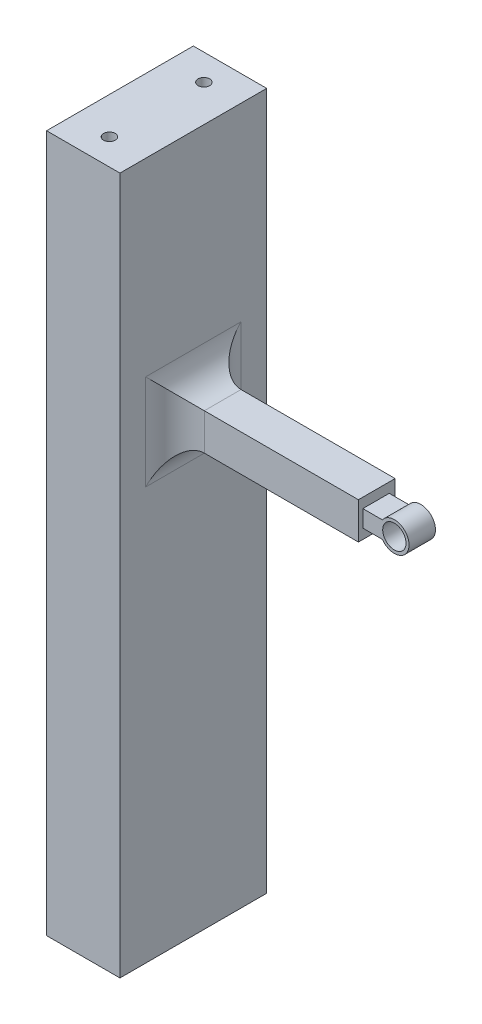
ISO-10303-21;
HEADER;
FILE_DESCRIPTION(('STEP AP214'),'2;1');
FILE_NAME('part.step','',(''),(''),'','','');
FILE_SCHEMA(('AUTOMOTIVE_DESIGN { 1 0 10303 214 1 1 1 1 }'));
ENDSEC;
DATA;
#1=APPLICATION_CONTEXT('core data for automotive mechanical design processes');
#2=APPLICATION_PROTOCOL_DEFINITION('international standard','automotive_design',2000,#1);
#3=PRODUCT_CONTEXT('',#1,'mechanical');
#4=PRODUCT('Part','Part','',(#3));
#5=PRODUCT_RELATED_PRODUCT_CATEGORY('part','',(#4));
#6=PRODUCT_DEFINITION_FORMATION('','',#4);
#7=PRODUCT_DEFINITION_CONTEXT('part definition',#1,'design');
#8=PRODUCT_DEFINITION('design','',#6,#7);
#9=PRODUCT_DEFINITION_SHAPE('','',#8);
#10=(LENGTH_UNIT() NAMED_UNIT(*) SI_UNIT(.MILLI.,.METRE.));
#11=(NAMED_UNIT(*) PLANE_ANGLE_UNIT() SI_UNIT($,.RADIAN.));
#12=(NAMED_UNIT(*) SI_UNIT($,.STERADIAN.) SOLID_ANGLE_UNIT());
#13=UNCERTAINTY_MEASURE_WITH_UNIT(LENGTH_MEASURE(1.E-05),#10,'distance_accuracy_value','');
#14=(GEOMETRIC_REPRESENTATION_CONTEXT(3) GLOBAL_UNCERTAINTY_ASSIGNED_CONTEXT((#13)) GLOBAL_UNIT_ASSIGNED_CONTEXT((#10,
#11,#12)) REPRESENTATION_CONTEXT('',''));
#15=CARTESIAN_POINT('',(0.,0.,0.));
#16=DIRECTION('',(0.,0.,1.));
#17=DIRECTION('',(1.,0.,0.));
#18=AXIS2_PLACEMENT_3D('',#15,#16,#17);
#19=CARTESIAN_POINT('',(137.135295270355,0.,0.));
#20=DIRECTION('',(1.,0.,0.));
#21=DIRECTION('',(0.,1.,0.));
#22=AXIS2_PLACEMENT_3D('',#19,#20,#21);
#23=PLANE('',#22);
#24=DIRECTION('',(0.,1.,0.));
#25=VECTOR('',#24,1.);
#26=CARTESIAN_POINT('',(137.135295270355,735.969884115391,75.));
#27=LINE('',#26,#25);
#28=CARTESIAN_POINT('',(137.135295270355,685.969884115391,75.));
#29=VERTEX_POINT('',#28);
#30=CARTESIAN_POINT('',(137.135295270355,735.969884115391,75.));
#31=VERTEX_POINT('',#30);
#32=EDGE_CURVE('E200',#29,#31,#27,.T.);
#33=ORIENTED_EDGE('',*,*,#32,.T.);
#34=DIRECTION('',(0.,0.,1.));
#35=VECTOR('',#34,1.);
#36=CARTESIAN_POINT('',(137.135295270355,735.969884115391,125.));
#37=LINE('',#36,#35);
#38=CARTESIAN_POINT('',(137.135295270355,735.969884115391,125.));
#39=VERTEX_POINT('',#38);
#40=EDGE_CURVE('E206',#31,#39,#37,.T.);
#41=ORIENTED_EDGE('',*,*,#40,.T.);
#42=DIRECTION('',(0.,-1.,0.));
#43=VECTOR('',#42,1.);
#44=CARTESIAN_POINT('',(137.135295270355,735.969884115391,125.));
#45=LINE('',#44,#43);
#46=CARTESIAN_POINT('',(137.135295270355,685.969884115391,125.));
#47=VERTEX_POINT('',#46);
#48=EDGE_CURVE('E211',#39,#47,#45,.T.);
#49=ORIENTED_EDGE('',*,*,#48,.T.);
#50=DIRECTION('',(0.,0.,-1.));
#51=VECTOR('',#50,1.);
#52=CARTESIAN_POINT('',(137.135295270355,685.969884115391,125.));
#53=LINE('',#52,#51);
#54=EDGE_CURVE('E218',#47,#29,#53,.T.);
#55=ORIENTED_EDGE('',*,*,#54,.T.);
#56=EDGE_LOOP('',(#33,#41,#49,#55));
#57=FACE_BOUND('',#56,.T.);
#58=DIRECTION('',(0.,0.,1.));
#59=VECTOR('',#58,1.);
#60=CARTESIAN_POINT('',(137.135295270355,699.447016823861,83.));
#61=LINE('',#60,#59);
#62=CARTESIAN_POINT('',(137.135295270355,699.447016823861,83.));
#63=VERTEX_POINT('',#62);
#64=CARTESIAN_POINT('',(137.135295270355,699.447016823861,119.));
#65=VERTEX_POINT('',#64);
#66=EDGE_CURVE('E192',#63,#65,#61,.T.);
#67=ORIENTED_EDGE('',*,*,#66,.T.);
#68=DIRECTION('',(0.,1.,0.));
#69=VECTOR('',#68,1.);
#70=CARTESIAN_POINT('',(137.135295270353,-3.30323083755885E-13,119.));
#71=LINE('',#70,#69);
#72=CARTESIAN_POINT('',(137.135295270355,722.49275140692,119.));
#73=VERTEX_POINT('',#72);
#74=EDGE_CURVE('E263',#65,#73,#71,.T.);
#75=ORIENTED_EDGE('',*,*,#74,.T.);
#76=DIRECTION('',(0.,0.,1.));
#77=VECTOR('',#76,1.);
#78=CARTESIAN_POINT('',(137.135295270355,722.49275140692,83.));
#79=LINE('',#78,#77);
#80=CARTESIAN_POINT('',(137.135295270355,722.49275140692,83.));
#81=VERTEX_POINT('',#80);
#82=EDGE_CURVE('E270',#81,#73,#79,.T.);
#83=ORIENTED_EDGE('',*,*,#82,.F.);
#84=DIRECTION('',(0.,1.,0.));
#85=VECTOR('',#84,1.);
#86=CARTESIAN_POINT('',(137.135295270353,-3.30323083755885E-13,83.));
#87=LINE('',#86,#85);
#88=EDGE_CURVE('E253',#63,#81,#87,.T.);
#89=ORIENTED_EDGE('',*,*,#88,.F.);
#90=EDGE_LOOP('',(#67,#75,#83,#89));
#91=FACE_BOUND('',#90,.T.);
#92=ADVANCED_FACE('F39',(#57,#91),#23,.T.);
#93=CARTESIAN_POINT('',(-112.864704729645,1033.96988411539,200.));
#94=DIRECTION('',(-1.,0.,0.));
#95=DIRECTION('',(0.,-1.,0.));
#96=AXIS2_PLACEMENT_3D('',#93,#94,#95);
#97=PLANE('',#96);
#98=DIRECTION('',(0.,0.,1.));
#99=VECTOR('',#98,1.);
#100=CARTESIAN_POINT('',(-112.864704729645,775.969884115391,75.));
#101=LINE('',#100,#99);
#102=CARTESIAN_POINT('',(-112.864704729645,775.969884115391,165.));
#103=VERTEX_POINT('',#102);
#104=CARTESIAN_POINT('',(-112.864704729645,775.969884115391,35.));
#105=VERTEX_POINT('',#104);
#106=EDGE_CURVE('E181',#103,#105,#101,.F.);
#107=ORIENTED_EDGE('',*,*,#106,.T.);
#108=DIRECTION('',(0.,1.,0.));
#109=VECTOR('',#108,1.);
#110=CARTESIAN_POINT('',(-112.864704729645,685.969884115391,35.));
#111=LINE('',#110,#109);
#112=CARTESIAN_POINT('',(-112.864704729645,645.969884115391,35.));
#113=VERTEX_POINT('',#112);
#114=EDGE_CURVE('E184',#105,#113,#111,.F.);
#115=ORIENTED_EDGE('',*,*,#114,.T.);
#116=DIRECTION('',(0.,0.,-1.));
#117=VECTOR('',#116,1.);
#118=CARTESIAN_POINT('',(-112.864704729645,645.969884115391,125.));
#119=LINE('',#118,#117);
#120=CARTESIAN_POINT('',(-112.864704729645,645.969884115391,165.));
#121=VERTEX_POINT('',#120);
#122=EDGE_CURVE('E179',#113,#121,#119,.F.);
#123=ORIENTED_EDGE('',*,*,#122,.T.);
#124=DIRECTION('',(0.,-1.,0.));
#125=VECTOR('',#124,1.);
#126=CARTESIAN_POINT('',(-112.864704729645,735.969884115391,165.));
#127=LINE('',#126,#125);
#128=EDGE_CURVE('E177',#121,#103,#127,.F.);
#129=ORIENTED_EDGE('',*,*,#128,.T.);
#130=EDGE_LOOP('',(#107,#115,#123,#129));
#131=FACE_BOUND('',#130,.T.);
#132=DIRECTION('',(0.,1.,0.));
#133=VECTOR('',#132,1.);
#134=CARTESIAN_POINT('',(-112.864704729645,1033.96988411539,200.));
#135=LINE('',#134,#133);
#136=CARTESIAN_POINT('',(-112.864704729645,83.9698841153906,200.));
#137=VERTEX_POINT('',#136);
#138=CARTESIAN_POINT('',(-112.864704729645,1033.96988411539,200.));
#139=VERTEX_POINT('',#138);
#140=EDGE_CURVE('E153',#137,#139,#135,.T.);
#141=ORIENTED_EDGE('',*,*,#140,.F.);
#142=DIRECTION('',(0.,0.,1.));
#143=VECTOR('',#142,1.);
#144=CARTESIAN_POINT('',(-112.864704729645,83.9698841153906,200.));
#145=LINE('',#144,#143);
#146=CARTESIAN_POINT('',(-112.864704729645,83.9698841153906,0.));
#147=VERTEX_POINT('',#146);
#148=EDGE_CURVE('E141',#147,#137,#145,.T.);
#149=ORIENTED_EDGE('',*,*,#148,.F.);
#150=DIRECTION('',(0.,1.,0.));
#151=VECTOR('',#150,1.);
#152=CARTESIAN_POINT('',(-112.864704729645,1033.96988411539,0.));
#153=LINE('',#152,#151);
#154=CARTESIAN_POINT('',(-112.864704729645,1033.96988411539,0.));
#155=VERTEX_POINT('',#154);
#156=EDGE_CURVE('E151',#147,#155,#153,.T.);
#157=ORIENTED_EDGE('',*,*,#156,.T.);
#158=DIRECTION('',(0.,0.,-1.));
#159=VECTOR('',#158,1.);
#160=CARTESIAN_POINT('',(-112.864704729645,1033.96988411539,200.));
#161=LINE('',#160,#159);
#162=EDGE_CURVE('E169',#139,#155,#161,.T.);
#163=ORIENTED_EDGE('',*,*,#162,.F.);
#164=EDGE_LOOP('',(#141,#149,#157,#163));
#165=FACE_BOUND('',#164,.T.);
#166=ADVANCED_FACE('F149',(#131,#165),#97,.F.);
#167=CARTESIAN_POINT('',(-112.864704729645,1033.96988411539,200.));
#168=DIRECTION('',(0.,-1.,0.));
#169=DIRECTION('',(0.,0.,-1.));
#170=AXIS2_PLACEMENT_3D('',#167,#168,#169);
#171=PLANE('',#170);
#172=CARTESIAN_POINT('',(-162.864704729645,1033.96988411539,35.6235));
#173=DIRECTION('',(0.,1.,0.));
#174=DIRECTION('',(0.,0.,1.));
#175=AXIS2_PLACEMENT_3D('',#172,#173,#174);
#176=CIRCLE('',#175,8.00000000000001);
#177=CARTESIAN_POINT('',(-162.864704729645,1033.96988411539,43.6235));
#178=VERTEX_POINT('',#177);
#179=EDGE_CURVE('E517',#178,#178,#176,.T.);
#180=ORIENTED_EDGE('',*,*,#179,.F.);
#181=EDGE_LOOP('',(#180));
#182=FACE_BOUND('',#181,.T.);
#183=CARTESIAN_POINT('',(-162.864704729645,1033.96988411539,164.3765));
#184=DIRECTION('',(0.,1.,0.));
#185=DIRECTION('',(0.,0.,1.));
#186=AXIS2_PLACEMENT_3D('',#183,#184,#185);
#187=CIRCLE('',#186,8.00000000000001);
#188=CARTESIAN_POINT('',(-162.864704729645,1033.96988411539,172.3765));
#189=VERTEX_POINT('',#188);
#190=EDGE_CURVE('E516',#189,#189,#187,.T.);
#191=ORIENTED_EDGE('',*,*,#190,.F.);
#192=EDGE_LOOP('',(#191));
#193=FACE_BOUND('',#192,.T.);
#194=DIRECTION('',(-1.,0.,0.));
#195=VECTOR('',#194,1.);
#196=CARTESIAN_POINT('',(-112.864704729645,1033.96988411539,0.));
#197=LINE('',#196,#195);
#198=CARTESIAN_POINT('',(-212.864704729645,1033.96988411539,0.));
#199=VERTEX_POINT('',#198);
#200=EDGE_CURVE('E159',#155,#199,#197,.T.);
#201=ORIENTED_EDGE('',*,*,#200,.T.);
#202=DIRECTION('',(0.,0.,-1.));
#203=VECTOR('',#202,1.);
#204=CARTESIAN_POINT('',(-212.864704729645,1033.96988411539,200.));
#205=LINE('',#204,#203);
#206=CARTESIAN_POINT('',(-212.864704729645,1033.96988411539,200.));
#207=VERTEX_POINT('',#206);
#208=EDGE_CURVE('E171',#207,#199,#205,.T.);
#209=ORIENTED_EDGE('',*,*,#208,.F.);
#210=DIRECTION('',(-1.,0.,0.));
#211=VECTOR('',#210,1.);
#212=CARTESIAN_POINT('',(-112.864704729645,1033.96988411539,200.));
#213=LINE('',#212,#211);
#214=EDGE_CURVE('E160',#139,#207,#213,.T.);
#215=ORIENTED_EDGE('',*,*,#214,.F.);
#216=ORIENTED_EDGE('',*,*,#162,.T.);
#217=EDGE_LOOP('',(#201,#209,#215,#216));
#218=FACE_BOUND('',#217,.T.);
#219=ADVANCED_FACE('F236',(#182,#193,#218),#171,.F.);
#220=CARTESIAN_POINT('',(-212.864704729645,1033.96988411539,200.));
#221=DIRECTION('',(1.,0.,0.));
#222=DIRECTION('',(0.,0.,-1.));
#223=AXIS2_PLACEMENT_3D('',#220,#221,#222);
#224=PLANE('',#223);
#225=DIRECTION('',(0.,-1.,0.));
#226=VECTOR('',#225,1.);
#227=CARTESIAN_POINT('',(-212.864704729645,1033.96988411539,0.));
#228=LINE('',#227,#226);
#229=CARTESIAN_POINT('',(-212.864704729645,83.9698841153906,0.));
#230=VERTEX_POINT('',#229);
#231=EDGE_CURVE('E161',#199,#230,#228,.T.);
#232=ORIENTED_EDGE('',*,*,#231,.T.);
#233=DIRECTION('',(0.,0.,-1.));
#234=VECTOR('',#233,1.);
#235=CARTESIAN_POINT('',(-212.864704729645,83.9698841153906,0.));
#236=LINE('',#235,#234);
#237=CARTESIAN_POINT('',(-212.864704729645,83.9698841153906,200.));
#238=VERTEX_POINT('',#237);
#239=EDGE_CURVE('E56',#238,#230,#236,.T.);
#240=ORIENTED_EDGE('',*,*,#239,.F.);
#241=DIRECTION('',(0.,-1.,0.));
#242=VECTOR('',#241,1.);
#243=CARTESIAN_POINT('',(-212.864704729645,1033.96988411539,200.));
#244=LINE('',#243,#242);
#245=EDGE_CURVE('E164',#207,#238,#244,.T.);
#246=ORIENTED_EDGE('',*,*,#245,.F.);
#247=ORIENTED_EDGE('',*,*,#208,.T.);
#248=EDGE_LOOP('',(#232,#240,#246,#247));
#249=FACE_BOUND('',#248,.T.);
#250=ADVANCED_FACE('F329',(#249),#224,.F.);
#251=CARTESIAN_POINT('',(0.,0.,200.));
#252=DIRECTION('',(0.,0.,1.));
#253=DIRECTION('',(1.,0.,0.));
#254=AXIS2_PLACEMENT_3D('',#251,#252,#253);
#255=PLANE('',#254);
#256=DIRECTION('',(-1.,0.,0.));
#257=VECTOR('',#256,1.);
#258=CARTESIAN_POINT('',(-212.864704729645,83.9698841153906,200.));
#259=LINE('',#258,#257);
#260=EDGE_CURVE('E154',#137,#238,#259,.T.);
#261=ORIENTED_EDGE('',*,*,#260,.F.);
#262=ORIENTED_EDGE('',*,*,#140,.T.);
#263=ORIENTED_EDGE('',*,*,#214,.T.);
#264=ORIENTED_EDGE('',*,*,#245,.T.);
#265=EDGE_LOOP('',(#261,#262,#263,#264));
#266=FACE_BOUND('',#265,.T.);
#267=ADVANCED_FACE('F239',(#266),#255,.T.);
#268=CARTESIAN_POINT('',(0.,0.,0.));
#269=DIRECTION('',(0.,0.,1.));
#270=DIRECTION('',(1.,0.,0.));
#271=AXIS2_PLACEMENT_3D('',#268,#269,#270);
#272=PLANE('',#271);
#273=ORIENTED_EDGE('',*,*,#156,.F.);
#274=DIRECTION('',(1.,0.,0.));
#275=VECTOR('',#274,1.);
#276=CARTESIAN_POINT('',(-112.864704729645,83.9698841153906,0.));
#277=LINE('',#276,#275);
#278=EDGE_CURVE('E138',#230,#147,#277,.T.);
#279=ORIENTED_EDGE('',*,*,#278,.F.);
#280=ORIENTED_EDGE('',*,*,#231,.F.);
#281=ORIENTED_EDGE('',*,*,#200,.F.);
#282=EDGE_LOOP('',(#273,#279,#280,#281));
#283=FACE_BOUND('',#282,.T.);
#284=ADVANCED_FACE('F157',(#283),#272,.F.);
#285=CARTESIAN_POINT('',(137.135295270355,735.969884115391,75.));
#286=DIRECTION('',(0.,0.,1.));
#287=DIRECTION('',(1.,0.,0.));
#288=AXIS2_PLACEMENT_3D('',#285,#286,#287);
#289=PLANE('',#288);
#290=DIRECTION('',(-1.,0.,0.));
#291=VECTOR('',#290,1.);
#292=CARTESIAN_POINT('',(137.135295270355,685.969884115391,75.));
#293=LINE('',#292,#291);
#294=CARTESIAN_POINT('',(-72.8647047296451,685.969884115391,75.));
#295=VERTEX_POINT('',#294);
#296=EDGE_CURVE('E220',#29,#295,#293,.T.);
#297=ORIENTED_EDGE('',*,*,#296,.T.);
#298=DIRECTION('',(0.,1.,0.));
#299=VECTOR('',#298,1.);
#300=CARTESIAN_POINT('',(-72.8647047296451,735.969884115391,75.));
#301=LINE('',#300,#299);
#302=CARTESIAN_POINT('',(-72.8647047296451,735.969884115391,75.));
#303=VERTEX_POINT('',#302);
#304=EDGE_CURVE('E48',#295,#303,#301,.T.);
#305=ORIENTED_EDGE('',*,*,#304,.T.);
#306=DIRECTION('',(-1.,0.,0.));
#307=VECTOR('',#306,1.);
#308=CARTESIAN_POINT('',(137.135295270355,735.969884115391,75.));
#309=LINE('',#308,#307);
#310=EDGE_CURVE('E229',#31,#303,#309,.T.);
#311=ORIENTED_EDGE('',*,*,#310,.F.);
#312=ORIENTED_EDGE('',*,*,#32,.F.);
#313=EDGE_LOOP('',(#297,#305,#311,#312));
#314=FACE_BOUND('',#313,.T.);
#315=ADVANCED_FACE('F322',(#314),#289,.F.);
#316=CARTESIAN_POINT('',(137.135295270355,735.969884115391,125.));
#317=DIRECTION('',(0.,-1.,0.));
#318=DIRECTION('',(1.,0.,0.));
#319=AXIS2_PLACEMENT_3D('',#316,#317,#318);
#320=PLANE('',#319);
#321=ORIENTED_EDGE('',*,*,#310,.T.);
#322=DIRECTION('',(0.,0.,1.));
#323=VECTOR('',#322,1.);
#324=CARTESIAN_POINT('',(-72.8647047296451,735.969884115391,125.));
#325=LINE('',#324,#323);
#326=CARTESIAN_POINT('',(-72.8647047296451,735.969884115391,125.));
#327=VERTEX_POINT('',#326);
#328=EDGE_CURVE('E174',#303,#327,#325,.T.);
#329=ORIENTED_EDGE('',*,*,#328,.T.);
#330=DIRECTION('',(-1.,0.,0.));
#331=VECTOR('',#330,1.);
#332=CARTESIAN_POINT('',(137.135295270355,735.969884115391,125.));
#333=LINE('',#332,#331);
#334=EDGE_CURVE('E226',#39,#327,#333,.T.);
#335=ORIENTED_EDGE('',*,*,#334,.F.);
#336=ORIENTED_EDGE('',*,*,#40,.F.);
#337=EDGE_LOOP('',(#321,#329,#335,#336));
#338=FACE_BOUND('',#337,.T.);
#339=ADVANCED_FACE('F318',(#338),#320,.F.);
#340=CARTESIAN_POINT('',(137.135295270355,735.969884115391,125.));
#341=DIRECTION('',(0.,0.,-1.));
#342=DIRECTION('',(-1.,0.,0.));
#343=AXIS2_PLACEMENT_3D('',#340,#341,#342);
#344=PLANE('',#343);
#345=ORIENTED_EDGE('',*,*,#334,.T.);
#346=DIRECTION('',(0.,-1.,0.));
#347=VECTOR('',#346,1.);
#348=CARTESIAN_POINT('',(-72.8647047296451,685.969884115391,125.));
#349=LINE('',#348,#347);
#350=CARTESIAN_POINT('',(-72.8647047296451,685.969884115391,125.));
#351=VERTEX_POINT('',#350);
#352=EDGE_CURVE('E11',#327,#351,#349,.T.);
#353=ORIENTED_EDGE('',*,*,#352,.T.);
#354=DIRECTION('',(-1.,0.,0.));
#355=VECTOR('',#354,1.);
#356=CARTESIAN_POINT('',(137.135295270355,685.969884115391,125.));
#357=LINE('',#356,#355);
#358=EDGE_CURVE('E223',#47,#351,#357,.T.);
#359=ORIENTED_EDGE('',*,*,#358,.F.);
#360=ORIENTED_EDGE('',*,*,#48,.F.);
#361=EDGE_LOOP('',(#345,#353,#359,#360));
#362=FACE_BOUND('',#361,.T.);
#363=ADVANCED_FACE('F314',(#362),#344,.F.);
#364=CARTESIAN_POINT('',(137.135295270355,685.969884115391,125.));
#365=DIRECTION('',(0.,1.,0.));
#366=DIRECTION('',(-1.,0.,0.));
#367=AXIS2_PLACEMENT_3D('',#364,#365,#366);
#368=PLANE('',#367);
#369=ORIENTED_EDGE('',*,*,#358,.T.);
#370=DIRECTION('',(0.,0.,-1.));
#371=VECTOR('',#370,1.);
#372=CARTESIAN_POINT('',(-72.8647047296451,685.969884115391,75.));
#373=LINE('',#372,#371);
#374=EDGE_CURVE('E186',#351,#295,#373,.T.);
#375=ORIENTED_EDGE('',*,*,#374,.T.);
#376=ORIENTED_EDGE('',*,*,#296,.F.);
#377=ORIENTED_EDGE('',*,*,#54,.F.);
#378=EDGE_LOOP('',(#369,#375,#376,#377));
#379=FACE_BOUND('',#378,.T.);
#380=ADVANCED_FACE('F311',(#379),#368,.F.);
#381=CARTESIAN_POINT('',(-72.8647047296451,645.969884115391,125.));
#382=DIRECTION('',(0.,0.,1.));
#383=DIRECTION('',(1.,0.,0.));
#384=AXIS2_PLACEMENT_3D('',#381,#382,#383);
#385=CYLINDRICAL_SURFACE('',#384,40.);
#386=CARTESIAN_POINT('',(-72.8647047296451,645.969884115391,165.));
#387=DIRECTION('',(0.,0.707106781186547,0.707106781186547));
#388=DIRECTION('',(0.,0.707106781186547,-0.707106781186547));
#389=AXIS2_PLACEMENT_3D('',#386,#387,#388);
#390=ELLIPSE('',#389,56.5685424949238,40.);
#391=EDGE_CURVE('E193',#121,#351,#390,.F.);
#392=ORIENTED_EDGE('',*,*,#391,.F.);
#393=ORIENTED_EDGE('',*,*,#122,.F.);
#394=CARTESIAN_POINT('',(-72.8647047296451,645.969884115391,35.));
#395=DIRECTION('',(0.,-0.707106781186547,0.707106781186547));
#396=DIRECTION('',(0.,-0.707106781186547,-0.707106781186547));
#397=AXIS2_PLACEMENT_3D('',#394,#395,#396);
#398=ELLIPSE('',#397,56.5685424949238,40.);
#399=EDGE_CURVE('E43',#295,#113,#398,.T.);
#400=ORIENTED_EDGE('',*,*,#399,.F.);
#401=ORIENTED_EDGE('',*,*,#374,.F.);
#402=EDGE_LOOP('',(#392,#393,#400,#401));
#403=FACE_BOUND('',#402,.T.);
#404=ADVANCED_FACE('F41',(#403),#385,.F.);
#405=CARTESIAN_POINT('',(-72.8647047296451,735.969884115391,35.));
#406=DIRECTION('',(0.,-1.,0.));
#407=DIRECTION('',(1.,0.,0.));
#408=AXIS2_PLACEMENT_3D('',#405,#406,#407);
#409=CYLINDRICAL_SURFACE('',#408,40.);
#410=ORIENTED_EDGE('',*,*,#399,.T.);
#411=ORIENTED_EDGE('',*,*,#114,.F.);
#412=CARTESIAN_POINT('',(-72.8647047296451,775.969884115391,35.));
#413=DIRECTION('',(0.,-0.707106781186547,-0.707106781186547));
#414=DIRECTION('',(0.,-0.707106781186547,0.707106781186547));
#415=AXIS2_PLACEMENT_3D('',#412,#413,#414);
#416=ELLIPSE('',#415,56.5685424949238,40.);
#417=EDGE_CURVE('E191',#303,#105,#416,.T.);
#418=ORIENTED_EDGE('',*,*,#417,.F.);
#419=ORIENTED_EDGE('',*,*,#304,.F.);
#420=EDGE_LOOP('',(#410,#411,#418,#419));
#421=FACE_BOUND('',#420,.T.);
#422=ADVANCED_FACE('F343',(#421),#409,.F.);
#423=CARTESIAN_POINT('',(-72.8647047296451,735.969884115391,165.));
#424=DIRECTION('',(0.,1.,0.));
#425=DIRECTION('',(-1.,0.,0.));
#426=AXIS2_PLACEMENT_3D('',#423,#424,#425);
#427=CYLINDRICAL_SURFACE('',#426,40.);
#428=ORIENTED_EDGE('',*,*,#391,.T.);
#429=ORIENTED_EDGE('',*,*,#352,.F.);
#430=CARTESIAN_POINT('',(-72.8647047296451,775.969884115391,165.));
#431=DIRECTION('',(0.,0.707106781186547,-0.707106781186547));
#432=DIRECTION('',(0.,0.707106781186547,0.707106781186547));
#433=AXIS2_PLACEMENT_3D('',#430,#431,#432);
#434=ELLIPSE('',#433,56.5685424949238,40.);
#435=EDGE_CURVE('E189',#103,#327,#434,.F.);
#436=ORIENTED_EDGE('',*,*,#435,.F.);
#437=ORIENTED_EDGE('',*,*,#128,.F.);
#438=EDGE_LOOP('',(#428,#429,#436,#437));
#439=FACE_BOUND('',#438,.T.);
#440=ADVANCED_FACE('F340',(#439),#427,.F.);
#441=CARTESIAN_POINT('',(-72.8647047296451,775.969884115391,125.));
#442=DIRECTION('',(0.,0.,-1.));
#443=DIRECTION('',(-1.,0.,0.));
#444=AXIS2_PLACEMENT_3D('',#441,#442,#443);
#445=CYLINDRICAL_SURFACE('',#444,40.);
#446=ORIENTED_EDGE('',*,*,#417,.T.);
#447=ORIENTED_EDGE('',*,*,#106,.F.);
#448=ORIENTED_EDGE('',*,*,#435,.T.);
#449=ORIENTED_EDGE('',*,*,#328,.F.);
#450=EDGE_LOOP('',(#446,#447,#448,#449));
#451=FACE_BOUND('',#450,.T.);
#452=ADVANCED_FACE('F300',(#451),#445,.F.);
#453=CARTESIAN_POINT('',(0.,699.447016823861,83.));
#454=DIRECTION('',(0.,-1.,0.));
#455=DIRECTION('',(0.,0.,-1.));
#456=AXIS2_PLACEMENT_3D('',#453,#454,#455);
#457=PLANE('',#456);
#458=DIRECTION('',(1.,0.,0.));
#459=VECTOR('',#458,1.);
#460=CARTESIAN_POINT('',(0.,699.447016823861,119.));
#461=LINE('',#460,#459);
#462=CARTESIAN_POINT('',(163.788322174953,699.447016823861,119.));
#463=VERTEX_POINT('',#462);
#464=EDGE_CURVE('E64',#65,#463,#461,.T.);
#465=ORIENTED_EDGE('',*,*,#464,.F.);
#466=ORIENTED_EDGE('',*,*,#66,.F.);
#467=DIRECTION('',(1.,0.,0.));
#468=VECTOR('',#467,1.);
#469=CARTESIAN_POINT('',(0.,699.447016823861,83.));
#470=LINE('',#469,#468);
#471=CARTESIAN_POINT('',(163.788322174953,699.447016823861,83.));
#472=VERTEX_POINT('',#471);
#473=EDGE_CURVE('E244',#63,#472,#470,.T.);
#474=ORIENTED_EDGE('',*,*,#473,.T.);
#475=DIRECTION('',(0.,0.,1.));
#476=VECTOR('',#475,1.);
#477=CARTESIAN_POINT('',(163.788322174953,699.447016823861,83.));
#478=LINE('',#477,#476);
#479=EDGE_CURVE('E214',#472,#463,#478,.T.);
#480=ORIENTED_EDGE('',*,*,#479,.T.);
#481=EDGE_LOOP('',(#465,#466,#474,#480));
#482=FACE_BOUND('',#481,.T.);
#483=ADVANCED_FACE('F275',(#482),#457,.T.);
#484=CARTESIAN_POINT('',(0.,722.49275140692,83.));
#485=DIRECTION('',(0.,-1.,0.));
#486=DIRECTION('',(0.,0.,-1.));
#487=AXIS2_PLACEMENT_3D('',#484,#485,#486);
#488=PLANE('',#487);
#489=DIRECTION('',(1.,0.,0.));
#490=VECTOR('',#489,1.);
#491=CARTESIAN_POINT('',(0.,722.49275140692,119.));
#492=LINE('',#491,#490);
#493=CARTESIAN_POINT('',(163.788322174953,722.49275140692,119.));
#494=VERTEX_POINT('',#493);
#495=EDGE_CURVE('E260',#73,#494,#492,.T.);
#496=ORIENTED_EDGE('',*,*,#495,.T.);
#497=DIRECTION('',(0.,0.,1.));
#498=VECTOR('',#497,1.);
#499=CARTESIAN_POINT('',(163.788322174953,722.49275140692,83.));
#500=LINE('',#499,#498);
#501=CARTESIAN_POINT('',(163.788322174953,722.49275140692,83.));
#502=VERTEX_POINT('',#501);
#503=EDGE_CURVE('E271',#502,#494,#500,.T.);
#504=ORIENTED_EDGE('',*,*,#503,.F.);
#505=DIRECTION('',(1.,0.,0.));
#506=VECTOR('',#505,1.);
#507=CARTESIAN_POINT('',(0.,722.49275140692,83.));
#508=LINE('',#507,#506);
#509=EDGE_CURVE('E251',#81,#502,#508,.T.);
#510=ORIENTED_EDGE('',*,*,#509,.F.);
#511=ORIENTED_EDGE('',*,*,#82,.T.);
#512=EDGE_LOOP('',(#496,#504,#510,#511));
#513=FACE_BOUND('',#512,.T.);
#514=ADVANCED_FACE('F291',(#513),#488,.F.);
#515=CARTESIAN_POINT('',(180.135295270355,710.969884115391,83.));
#516=DIRECTION('',(0.,0.,1.));
#517=DIRECTION('',(1.,0.,0.));
#518=AXIS2_PLACEMENT_3D('',#515,#516,#517);
#519=CYLINDRICAL_SURFACE('',#518,20.);
#520=CARTESIAN_POINT('',(180.135295270355,710.969884115391,119.));
#521=DIRECTION('',(0.,0.,1.));
#522=DIRECTION('',(1.,0.,0.));
#523=AXIS2_PLACEMENT_3D('',#520,#521,#522);
#524=CIRCLE('',#523,20.);
#525=EDGE_CURVE('E241',#463,#494,#524,.T.);
#526=ORIENTED_EDGE('',*,*,#525,.F.);
#527=ORIENTED_EDGE('',*,*,#479,.F.);
#528=CARTESIAN_POINT('',(180.135295270355,710.969884115391,83.));
#529=DIRECTION('',(0.,0.,1.));
#530=DIRECTION('',(1.,0.,0.));
#531=AXIS2_PLACEMENT_3D('',#528,#529,#530);
#532=CIRCLE('',#531,20.);
#533=EDGE_CURVE('E247',#472,#502,#532,.T.);
#534=ORIENTED_EDGE('',*,*,#533,.T.);
#535=ORIENTED_EDGE('',*,*,#503,.T.);
#536=EDGE_LOOP('',(#526,#527,#534,#535));
#537=FACE_BOUND('',#536,.T.);
#538=ADVANCED_FACE('F278',(#537),#519,.T.);
#539=CARTESIAN_POINT('',(180.135295270355,710.969884115391,83.));
#540=DIRECTION('',(0.,0.,1.));
#541=DIRECTION('',(1.,0.,0.));
#542=AXIS2_PLACEMENT_3D('',#539,#540,#541);
#543=CYLINDRICAL_SURFACE('',#542,15.875);
#544=CARTESIAN_POINT('',(180.135295270355,710.969884115391,83.));
#545=DIRECTION('',(0.,0.,1.));
#546=DIRECTION('',(1.,0.,0.));
#547=AXIS2_PLACEMENT_3D('',#544,#545,#546);
#548=CIRCLE('',#547,15.875);
#549=CARTESIAN_POINT('',(196.010295270355,710.969884115391,83.));
#550=VERTEX_POINT('',#549);
#551=EDGE_CURVE('E255',#550,#550,#548,.T.);
#552=ORIENTED_EDGE('',*,*,#551,.F.);
#553=EDGE_LOOP('',(#552));
#554=FACE_BOUND('',#553,.T.);
#555=CARTESIAN_POINT('',(180.135295270355,710.969884115391,119.));
#556=DIRECTION('',(0.,0.,1.));
#557=DIRECTION('',(1.,0.,0.));
#558=AXIS2_PLACEMENT_3D('',#555,#556,#557);
#559=CIRCLE('',#558,15.875);
#560=CARTESIAN_POINT('',(196.010295270355,710.969884115391,119.));
#561=VERTEX_POINT('',#560);
#562=EDGE_CURVE('E248',#561,#561,#559,.T.);
#563=ORIENTED_EDGE('',*,*,#562,.T.);
#564=EDGE_LOOP('',(#563));
#565=FACE_BOUND('',#564,.T.);
#566=ADVANCED_FACE('F298',(#554,#565),#543,.F.);
#567=CARTESIAN_POINT('',(0.,0.,83.));
#568=DIRECTION('',(0.,0.,1.));
#569=DIRECTION('',(1.,0.,0.));
#570=AXIS2_PLACEMENT_3D('',#567,#568,#569);
#571=PLANE('',#570);
#572=ORIENTED_EDGE('',*,*,#473,.F.);
#573=ORIENTED_EDGE('',*,*,#88,.T.);
#574=ORIENTED_EDGE('',*,*,#509,.T.);
#575=ORIENTED_EDGE('',*,*,#533,.F.);
#576=EDGE_LOOP('',(#572,#573,#574,#575));
#577=FACE_BOUND('',#576,.T.);
#578=ORIENTED_EDGE('',*,*,#551,.T.);
#579=EDGE_LOOP('',(#578));
#580=FACE_BOUND('',#579,.T.);
#581=ADVANCED_FACE('F287',(#577,#580),#571,.F.);
#582=CARTESIAN_POINT('',(0.,0.,119.));
#583=DIRECTION('',(0.,0.,1.));
#584=DIRECTION('',(1.,0.,0.));
#585=AXIS2_PLACEMENT_3D('',#582,#583,#584);
#586=PLANE('',#585);
#587=ORIENTED_EDGE('',*,*,#464,.T.);
#588=ORIENTED_EDGE('',*,*,#525,.T.);
#589=ORIENTED_EDGE('',*,*,#495,.F.);
#590=ORIENTED_EDGE('',*,*,#74,.F.);
#591=EDGE_LOOP('',(#587,#588,#589,#590));
#592=FACE_BOUND('',#591,.T.);
#593=ORIENTED_EDGE('',*,*,#562,.F.);
#594=EDGE_LOOP('',(#593));
#595=FACE_BOUND('',#594,.T.);
#596=ADVANCED_FACE('F281',(#592,#595),#586,.T.);
#597=CARTESIAN_POINT('',(0.,83.9698841153906,0.));
#598=DIRECTION('',(0.,1.,0.));
#599=DIRECTION('',(0.,0.,1.));
#600=AXIS2_PLACEMENT_3D('',#597,#598,#599);
#601=PLANE('',#600);
#602=CARTESIAN_POINT('',(-162.864704729645,83.9698841153906,100.));
#603=DIRECTION('',(0.,-1.,0.));
#604=DIRECTION('',(0.,0.,-1.));
#605=AXIS2_PLACEMENT_3D('',#602,#603,#604);
#606=CIRCLE('',#605,26.);
#607=CARTESIAN_POINT('',(-162.864704729645,83.9698841153906,74.));
#608=VERTEX_POINT('',#607);
#609=EDGE_CURVE('E526',#608,#608,#606,.T.);
#610=ORIENTED_EDGE('',*,*,#609,.F.);
#611=EDGE_LOOP('',(#610));
#612=FACE_BOUND('',#611,.T.);
#613=ORIENTED_EDGE('',*,*,#239,.T.);
#614=ORIENTED_EDGE('',*,*,#278,.T.);
#615=ORIENTED_EDGE('',*,*,#148,.T.);
#616=ORIENTED_EDGE('',*,*,#260,.T.);
#617=EDGE_LOOP('',(#613,#614,#615,#616));
#618=FACE_BOUND('',#617,.T.);
#619=ADVANCED_FACE('F140',(#612,#618),#601,.F.);
#620=CARTESIAN_POINT('',(-162.864704729645,123.969884115391,100.));
#621=DIRECTION('',(0.,-1.,0.));
#622=DIRECTION('',(0.,0.,-1.));
#623=AXIS2_PLACEMENT_3D('',#620,#621,#622);
#624=CYLINDRICAL_SURFACE('',#623,26.);
#625=CARTESIAN_POINT('',(-162.864704729645,123.969884115391,100.));
#626=DIRECTION('',(0.,-1.,0.));
#627=DIRECTION('',(0.,0.,-1.));
#628=AXIS2_PLACEMENT_3D('',#625,#626,#627);
#629=CIRCLE('',#628,26.);
#630=CARTESIAN_POINT('',(-162.864704729645,123.969884115391,74.));
#631=VERTEX_POINT('',#630);
#632=EDGE_CURVE('E528',#631,#631,#629,.T.);
#633=ORIENTED_EDGE('',*,*,#632,.F.);
#634=EDGE_LOOP('',(#633));
#635=FACE_BOUND('',#634,.T.);
#636=ORIENTED_EDGE('',*,*,#609,.T.);
#637=EDGE_LOOP('',(#636));
#638=FACE_BOUND('',#637,.T.);
#639=ADVANCED_FACE('F487',(#635,#638),#624,.F.);
#640=CARTESIAN_POINT('',(-162.864704729645,123.969884115391,100.));
#641=DIRECTION('',(0.,-1.,0.));
#642=DIRECTION('',(0.,0.,-1.));
#643=AXIS2_PLACEMENT_3D('',#640,#641,#642);
#644=PLANE('',#643);
#645=ORIENTED_EDGE('',*,*,#632,.T.);
#646=EDGE_LOOP('',(#645));
#647=FACE_BOUND('',#646,.T.);
#648=ADVANCED_FACE('F491',(#647),#644,.T.);
#649=CARTESIAN_POINT('',(-162.864704729645,993.969884115391,164.3765));
#650=DIRECTION('',(0.,1.,0.));
#651=DIRECTION('',(0.,0.,1.));
#652=AXIS2_PLACEMENT_3D('',#649,#650,#651);
#653=CYLINDRICAL_SURFACE('',#652,8.00000000000001);
#654=CARTESIAN_POINT('',(-162.864704729645,993.969884115391,164.3765));
#655=DIRECTION('',(0.,1.,0.));
#656=DIRECTION('',(0.,0.,1.));
#657=AXIS2_PLACEMENT_3D('',#654,#655,#656);
#658=CIRCLE('',#657,8.00000000000001);
#659=CARTESIAN_POINT('',(-162.864704729645,993.969884115391,172.3765));
#660=VERTEX_POINT('',#659);
#661=EDGE_CURVE('E520',#660,#660,#658,.T.);
#662=ORIENTED_EDGE('',*,*,#661,.F.);
#663=EDGE_LOOP('',(#662));
#664=FACE_BOUND('',#663,.T.);
#665=ORIENTED_EDGE('',*,*,#190,.T.);
#666=EDGE_LOOP('',(#665));
#667=FACE_BOUND('',#666,.T.);
#668=ADVANCED_FACE('F495',(#664,#667),#653,.F.);
#669=CARTESIAN_POINT('',(0.,993.969884115391,0.));
#670=DIRECTION('',(0.,1.,0.));
#671=DIRECTION('',(0.,0.,1.));
#672=AXIS2_PLACEMENT_3D('',#669,#670,#671);
#673=PLANE('',#672);
#674=ORIENTED_EDGE('',*,*,#661,.T.);
#675=EDGE_LOOP('',(#674));
#676=FACE_BOUND('',#675,.T.);
#677=ADVANCED_FACE('F499',(#676),#673,.T.);
#678=CARTESIAN_POINT('',(-162.864704729645,993.969884115391,35.6235));
#679=DIRECTION('',(0.,1.,0.));
#680=DIRECTION('',(0.,0.,1.));
#681=AXIS2_PLACEMENT_3D('',#678,#679,#680);
#682=CYLINDRICAL_SURFACE('',#681,8.00000000000001);
#683=CARTESIAN_POINT('',(-162.864704729645,993.969884115391,35.6235));
#684=DIRECTION('',(0.,1.,0.));
#685=DIRECTION('',(0.,0.,1.));
#686=AXIS2_PLACEMENT_3D('',#683,#684,#685);
#687=CIRCLE('',#686,8.00000000000001);
#688=CARTESIAN_POINT('',(-162.864704729645,993.969884115391,43.6235));
#689=VERTEX_POINT('',#688);
#690=EDGE_CURVE('E515',#689,#689,#687,.T.);
#691=ORIENTED_EDGE('',*,*,#690,.F.);
#692=EDGE_LOOP('',(#691));
#693=FACE_BOUND('',#692,.T.);
#694=ORIENTED_EDGE('',*,*,#179,.T.);
#695=EDGE_LOOP('',(#694));
#696=FACE_BOUND('',#695,.T.);
#697=ADVANCED_FACE('F503',(#693,#696),#682,.F.);
#698=CARTESIAN_POINT('',(0.,993.969884115391,0.));
#699=DIRECTION('',(0.,1.,0.));
#700=DIRECTION('',(0.,0.,1.));
#701=AXIS2_PLACEMENT_3D('',#698,#699,#700);
#702=PLANE('',#701);
#703=ORIENTED_EDGE('',*,*,#690,.T.);
#704=EDGE_LOOP('',(#703));
#705=FACE_BOUND('',#704,.T.);
#706=ADVANCED_FACE('F507',(#705),#702,.T.);
#707=CLOSED_SHELL('',(#92,#166,#219,#250,#267,#284,#315,#339,#363,#380,#404,#422,#440,#452,#483,
#514,#538,#566,#581,#596,#619,#639,#648,#668,#677,#697,#706));
#708=MANIFOLD_SOLID_BREP('B2',#707);
#709=ADVANCED_BREP_SHAPE_REPRESENTATION('',(#18,#708),#14);
#710=SHAPE_DEFINITION_REPRESENTATION(#9,#709);
ENDSEC;
END-ISO-10303-21;
